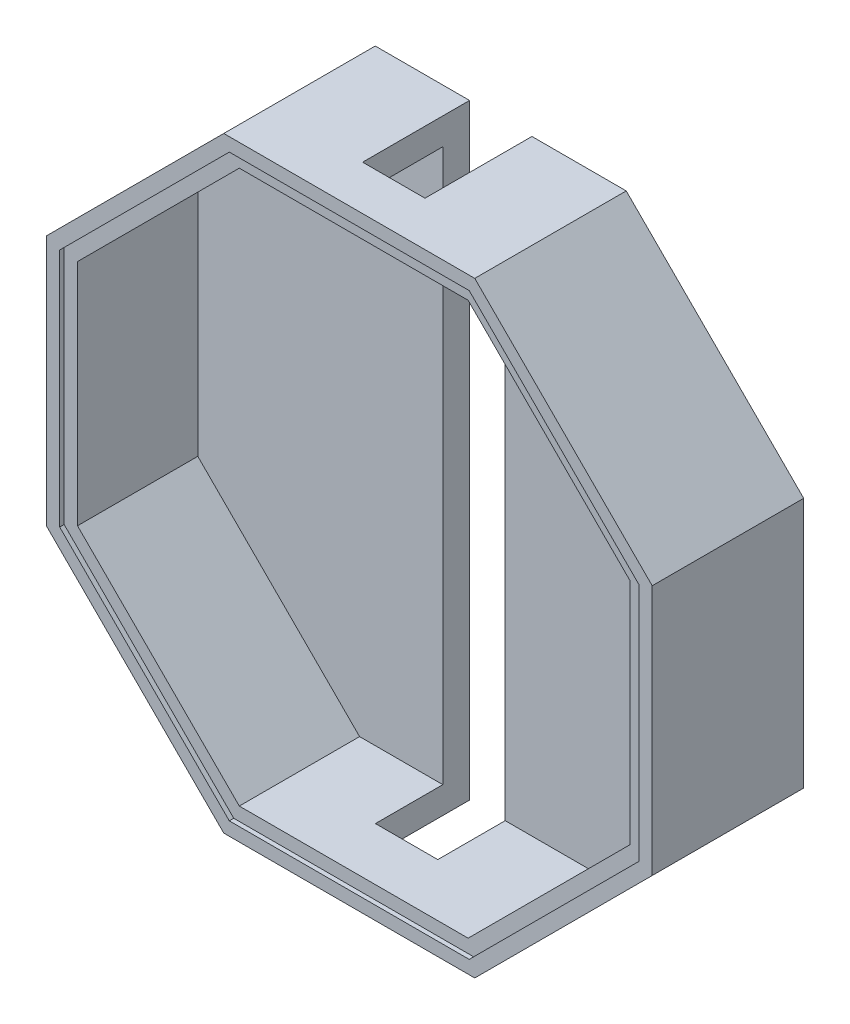
ISO-10303-21;
HEADER;
FILE_DESCRIPTION(('STEP AP214'),'2;1');
FILE_NAME('part.step','',(''),(''),'','','');
FILE_SCHEMA(('AUTOMOTIVE_DESIGN { 1 0 10303 214 1 1 1 1 }'));
ENDSEC;
DATA;
#1=APPLICATION_CONTEXT('core data for automotive mechanical design processes');
#2=APPLICATION_PROTOCOL_DEFINITION('international standard','automotive_design',2000,#1);
#3=PRODUCT_CONTEXT('',#1,'mechanical');
#4=PRODUCT('Part','Part','',(#3));
#5=PRODUCT_RELATED_PRODUCT_CATEGORY('part','',(#4));
#6=PRODUCT_DEFINITION_FORMATION('','',#4);
#7=PRODUCT_DEFINITION_CONTEXT('part definition',#1,'design');
#8=PRODUCT_DEFINITION('design','',#6,#7);
#9=PRODUCT_DEFINITION_SHAPE('','',#8);
#10=(LENGTH_UNIT() NAMED_UNIT(*) SI_UNIT(.MILLI.,.METRE.));
#11=(NAMED_UNIT(*) PLANE_ANGLE_UNIT() SI_UNIT($,.RADIAN.));
#12=(NAMED_UNIT(*) SI_UNIT($,.STERADIAN.) SOLID_ANGLE_UNIT());
#13=UNCERTAINTY_MEASURE_WITH_UNIT(LENGTH_MEASURE(1.E-05),#10,'distance_accuracy_value','');
#14=(GEOMETRIC_REPRESENTATION_CONTEXT(3) GLOBAL_UNCERTAINTY_ASSIGNED_CONTEXT((#13)) GLOBAL_UNIT_ASSIGNED_CONTEXT((#10,
#11,#12)) REPRESENTATION_CONTEXT('',''));
#15=CARTESIAN_POINT('',(0.,0.,0.));
#16=DIRECTION('',(0.,0.,1.));
#17=DIRECTION('',(1.,0.,0.));
#18=AXIS2_PLACEMENT_3D('',#15,#16,#17);
#19=CARTESIAN_POINT('',(-22.225,215.9,12.7));
#20=DIRECTION('',(0.,-0.0220534586670345,0.999756792905565));
#21=DIRECTION('',(0.,-0.999756792905565,-0.0220534586670345));
#22=AXIS2_PLACEMENT_3D('',#19,#20,#21);
#23=PLANE('',#22);
#24=DIRECTION('',(-1.,0.,0.));
#25=VECTOR('',#24,1.);
#26=CARTESIAN_POINT('',(-22.225,-196.85,3.59522058823529));
#27=LINE('',#26,#25);
#28=CARTESIAN_POINT('',(22.225,-196.85,3.59522058823529));
#29=VERTEX_POINT('',#28);
#30=CARTESIAN_POINT('',(-22.225,-196.85,3.59522058823529));
#31=VERTEX_POINT('',#30);
#32=EDGE_CURVE('E279',#29,#31,#27,.T.);
#33=ORIENTED_EDGE('',*,*,#32,.F.);
#34=DIRECTION('',(0.,-0.999756792905565,-0.0220534586670345));
#35=VECTOR('',#34,1.);
#36=CARTESIAN_POINT('',(22.225,215.9,12.7));
#37=LINE('',#36,#35);
#38=CARTESIAN_POINT('',(22.225,-215.9,3.17499999999998));
#39=VERTEX_POINT('',#38);
#40=EDGE_CURVE('E417',#29,#39,#37,.T.);
#41=ORIENTED_EDGE('',*,*,#40,.T.);
#42=DIRECTION('',(1.,0.,0.));
#43=VECTOR('',#42,1.);
#44=CARTESIAN_POINT('',(-22.225,-215.9,3.17499999999999));
#45=LINE('',#44,#43);
#46=CARTESIAN_POINT('',(-22.225,-215.9,3.17499999999999));
#47=VERTEX_POINT('',#46);
#48=EDGE_CURVE('E422',#47,#39,#45,.T.);
#49=ORIENTED_EDGE('',*,*,#48,.F.);
#50=DIRECTION('',(0.,-0.999756792905565,-0.0220534586670345));
#51=VECTOR('',#50,1.);
#52=CARTESIAN_POINT('',(-22.225,215.9,12.7));
#53=LINE('',#52,#51);
#54=EDGE_CURVE('E403',#31,#47,#53,.T.);
#55=ORIENTED_EDGE('',*,*,#54,.F.);
#56=EDGE_LOOP('',(#33,#41,#49,#55));
#57=FACE_BOUND('',#56,.T.);
#58=ADVANCED_FACE('F37',(#57),#23,.F.);
#59=CARTESIAN_POINT('',(-22.225,0.,0.));
#60=DIRECTION('',(-1.,0.,0.));
#61=DIRECTION('',(0.,0.,1.));
#62=AXIS2_PLACEMENT_3D('',#59,#60,#61);
#63=PLANE('',#62);
#64=DIRECTION('',(0.,0.,-1.));
#65=VECTOR('',#64,1.);
#66=CARTESIAN_POINT('',(-22.225,-196.85,0.));
#67=LINE('',#66,#65);
#68=CARTESIAN_POINT('',(-22.225,-196.85,-44.45));
#69=VERTEX_POINT('',#68);
#70=EDGE_CURVE('E270',#31,#69,#67,.T.);
#71=ORIENTED_EDGE('',*,*,#70,.F.);
#72=ORIENTED_EDGE('',*,*,#54,.T.);
#73=DIRECTION('',(0.,0.,-1.));
#74=VECTOR('',#73,1.);
#75=CARTESIAN_POINT('',(-22.225,-215.9,3.17499999999999));
#76=LINE('',#75,#74);
#77=CARTESIAN_POINT('',(-22.225,-215.9,-63.5));
#78=VERTEX_POINT('',#77);
#79=EDGE_CURVE('E407',#47,#78,#76,.T.);
#80=ORIENTED_EDGE('',*,*,#79,.T.);
#81=DIRECTION('',(0.,1.,0.));
#82=VECTOR('',#81,1.);
#83=CARTESIAN_POINT('',(-22.225,-215.9,-63.5));
#84=LINE('',#83,#82);
#85=CARTESIAN_POINT('',(-22.225,215.9,-63.5));
#86=VERTEX_POINT('',#85);
#87=EDGE_CURVE('E415',#78,#86,#84,.T.);
#88=ORIENTED_EDGE('',*,*,#87,.T.);
#89=DIRECTION('',(0.,0.,1.));
#90=VECTOR('',#89,1.);
#91=CARTESIAN_POINT('',(-22.225,215.9,-63.5));
#92=LINE('',#91,#90);
#93=CARTESIAN_POINT('',(-22.225,215.9,12.7));
#94=VERTEX_POINT('',#93);
#95=EDGE_CURVE('E405',#86,#94,#92,.T.);
#96=ORIENTED_EDGE('',*,*,#95,.T.);
#97=CARTESIAN_POINT('',(-22.225,196.85,12.2797794117647));
#98=VERTEX_POINT('',#97);
#99=EDGE_CURVE('E410',#94,#98,#53,.T.);
#100=ORIENTED_EDGE('',*,*,#99,.T.);
#101=DIRECTION('',(0.,0.,-1.));
#102=VECTOR('',#101,1.);
#103=CARTESIAN_POINT('',(-22.225,196.85,0.));
#104=LINE('',#103,#102);
#105=CARTESIAN_POINT('',(-22.225,196.85,-44.45));
#106=VERTEX_POINT('',#105);
#107=EDGE_CURVE('E281',#98,#106,#104,.T.);
#108=ORIENTED_EDGE('',*,*,#107,.T.);
#109=DIRECTION('',(0.,1.,0.));
#110=VECTOR('',#109,1.);
#111=CARTESIAN_POINT('',(-22.225,0.,-44.45));
#112=LINE('',#111,#110);
#113=EDGE_CURVE('E275',#69,#106,#112,.T.);
#114=ORIENTED_EDGE('',*,*,#113,.F.);
#115=EDGE_LOOP('',(#71,#72,#80,#88,#96,#100,#108,#114));
#116=FACE_BOUND('',#115,.T.);
#117=ADVANCED_FACE('F555',(#116),#63,.F.);
#118=CARTESIAN_POINT('',(22.225,0.,0.));
#119=DIRECTION('',(-1.,0.,0.));
#120=DIRECTION('',(0.,0.,1.));
#121=AXIS2_PLACEMENT_3D('',#118,#119,#120);
#122=PLANE('',#121);
#123=ORIENTED_EDGE('',*,*,#40,.F.);
#124=DIRECTION('',(0.,0.,-1.));
#125=VECTOR('',#124,1.);
#126=CARTESIAN_POINT('',(22.225,-196.85,0.));
#127=LINE('',#126,#125);
#128=CARTESIAN_POINT('',(22.225,-196.85,-44.45));
#129=VERTEX_POINT('',#128);
#130=EDGE_CURVE('E271',#29,#129,#127,.T.);
#131=ORIENTED_EDGE('',*,*,#130,.T.);
#132=DIRECTION('',(0.,1.,0.));
#133=VECTOR('',#132,1.);
#134=CARTESIAN_POINT('',(22.225,0.,-44.45));
#135=LINE('',#134,#133);
#136=CARTESIAN_POINT('',(22.225,196.85,-44.45));
#137=VERTEX_POINT('',#136);
#138=EDGE_CURVE('E252',#129,#137,#135,.T.);
#139=ORIENTED_EDGE('',*,*,#138,.T.);
#140=DIRECTION('',(0.,0.,-1.));
#141=VECTOR('',#140,1.);
#142=CARTESIAN_POINT('',(22.225,196.85,0.));
#143=LINE('',#142,#141);
#144=CARTESIAN_POINT('',(22.225,196.85,12.2797794117647));
#145=VERTEX_POINT('',#144);
#146=EDGE_CURVE('E265',#145,#137,#143,.T.);
#147=ORIENTED_EDGE('',*,*,#146,.F.);
#148=CARTESIAN_POINT('',(22.225,215.9,12.7));
#149=VERTEX_POINT('',#148);
#150=EDGE_CURVE('E416',#149,#145,#37,.T.);
#151=ORIENTED_EDGE('',*,*,#150,.F.);
#152=DIRECTION('',(0.,0.,1.));
#153=VECTOR('',#152,1.);
#154=CARTESIAN_POINT('',(22.225,215.9,-63.5));
#155=LINE('',#154,#153);
#156=CARTESIAN_POINT('',(22.225,215.9,-63.5));
#157=VERTEX_POINT('',#156);
#158=EDGE_CURVE('E259',#157,#149,#155,.T.);
#159=ORIENTED_EDGE('',*,*,#158,.F.);
#160=DIRECTION('',(0.,1.,0.));
#161=VECTOR('',#160,1.);
#162=CARTESIAN_POINT('',(22.225,-215.9,-63.5));
#163=LINE('',#162,#161);
#164=CARTESIAN_POINT('',(22.225,-215.9,-63.5));
#165=VERTEX_POINT('',#164);
#166=EDGE_CURVE('E408',#165,#157,#163,.T.);
#167=ORIENTED_EDGE('',*,*,#166,.F.);
#168=DIRECTION('',(0.,0.,-1.));
#169=VECTOR('',#168,1.);
#170=CARTESIAN_POINT('',(22.225,-215.9,3.17499999999999));
#171=LINE('',#170,#169);
#172=EDGE_CURVE('E419',#39,#165,#171,.T.);
#173=ORIENTED_EDGE('',*,*,#172,.F.);
#174=EDGE_LOOP('',(#123,#131,#139,#147,#151,#159,#167,#173));
#175=FACE_BOUND('',#174,.T.);
#176=ADVANCED_FACE('F269',(#175),#122,.T.);
#177=CARTESIAN_POINT('',(0.,0.,44.45));
#178=DIRECTION('',(0.,0.,-1.));
#179=DIRECTION('',(-1.,0.,0.));
#180=AXIS2_PLACEMENT_3D('',#177,#178,#179);
#181=PLANE('',#180);
#182=DIRECTION('',(-1.,0.,0.));
#183=VECTOR('',#182,1.);
#184=CARTESIAN_POINT('',(85.4833239347475,206.375,44.45));
#185=LINE('',#184,#183);
#186=CARTESIAN_POINT('',(85.4833239347475,206.375,44.45));
#187=VERTEX_POINT('',#186);
#188=CARTESIAN_POINT('',(-85.4833239347476,206.375,44.45));
#189=VERTEX_POINT('',#188);
#190=EDGE_CURVE('E311',#187,#189,#185,.T.);
#191=ORIENTED_EDGE('',*,*,#190,.F.);
#192=DIRECTION('',(-0.707106781186548,0.707106781186547,0.));
#193=VECTOR('',#192,1.);
#194=CARTESIAN_POINT('',(206.375,85.4833239347476,44.45));
#195=LINE('',#194,#193);
#196=CARTESIAN_POINT('',(206.375,85.4833239347476,44.45));
#197=VERTEX_POINT('',#196);
#198=EDGE_CURVE('E61',#197,#187,#195,.T.);
#199=ORIENTED_EDGE('',*,*,#198,.F.);
#200=DIRECTION('',(0.,1.,0.));
#201=VECTOR('',#200,1.);
#202=CARTESIAN_POINT('',(206.375,-85.4833239347475,44.45));
#203=LINE('',#202,#201);
#204=CARTESIAN_POINT('',(206.375,-85.4833239347475,44.45));
#205=VERTEX_POINT('',#204);
#206=EDGE_CURVE('E289',#205,#197,#203,.T.);
#207=ORIENTED_EDGE('',*,*,#206,.F.);
#208=DIRECTION('',(0.707106781186547,0.707106781186548,0.));
#209=VECTOR('',#208,1.);
#210=CARTESIAN_POINT('',(85.4833239347476,-206.375,44.45));
#211=LINE('',#210,#209);
#212=CARTESIAN_POINT('',(85.4833239347476,-206.375,44.45));
#213=VERTEX_POINT('',#212);
#214=EDGE_CURVE('E327',#213,#205,#211,.T.);
#215=ORIENTED_EDGE('',*,*,#214,.F.);
#216=DIRECTION('',(1.,0.,0.));
#217=VECTOR('',#216,1.);
#218=CARTESIAN_POINT('',(-85.4833239347473,-206.375,44.45));
#219=LINE('',#218,#217);
#220=CARTESIAN_POINT('',(-85.4833239347473,-206.375,44.45));
#221=VERTEX_POINT('',#220);
#222=EDGE_CURVE('E324',#221,#213,#219,.T.);
#223=ORIENTED_EDGE('',*,*,#222,.F.);
#224=DIRECTION('',(0.707106781186548,-0.707106781186547,0.));
#225=VECTOR('',#224,1.);
#226=CARTESIAN_POINT('',(-206.375,-85.4833239347475,44.45));
#227=LINE('',#226,#225);
#228=CARTESIAN_POINT('',(-206.375,-85.4833239347475,44.45));
#229=VERTEX_POINT('',#228);
#230=EDGE_CURVE('E325',#229,#221,#227,.T.);
#231=ORIENTED_EDGE('',*,*,#230,.F.);
#232=DIRECTION('',(0.,-1.,0.));
#233=VECTOR('',#232,1.);
#234=CARTESIAN_POINT('',(-206.375,85.4833239347474,44.45));
#235=LINE('',#234,#233);
#236=CARTESIAN_POINT('',(-206.375,85.4833239347474,44.45));
#237=VERTEX_POINT('',#236);
#238=EDGE_CURVE('E317',#237,#229,#235,.T.);
#239=ORIENTED_EDGE('',*,*,#238,.F.);
#240=DIRECTION('',(-0.707106781186547,-0.707106781186548,0.));
#241=VECTOR('',#240,1.);
#242=CARTESIAN_POINT('',(-85.4833239347476,206.375,44.45));
#243=LINE('',#242,#241);
#244=EDGE_CURVE('E316',#189,#237,#243,.T.);
#245=ORIENTED_EDGE('',*,*,#244,.F.);
#246=EDGE_LOOP('',(#191,#199,#207,#215,#223,#231,#239,#245));
#247=FACE_BOUND('',#246,.T.);
#248=DIRECTION('',(-1.,0.,0.));
#249=VECTOR('',#248,1.);
#250=CARTESIAN_POINT('',(0.,215.9,44.45));
#251=LINE('',#250,#249);
#252=CARTESIAN_POINT('',(89.4287081163512,215.9,44.45));
#253=VERTEX_POINT('',#252);
#254=CARTESIAN_POINT('',(-89.4287081163513,215.9,44.45));
#255=VERTEX_POINT('',#254);
#256=EDGE_CURVE('E464',#253,#255,#251,.T.);
#257=ORIENTED_EDGE('',*,*,#256,.T.);
#258=DIRECTION('',(-0.707106781186547,-0.707106781186548,0.));
#259=VECTOR('',#258,1.);
#260=CARTESIAN_POINT('',(-89.4287081163513,215.9,44.45));
#261=LINE('',#260,#259);
#262=CARTESIAN_POINT('',(-215.9,89.4287081163511,44.45));
#263=VERTEX_POINT('',#262);
#264=EDGE_CURVE('E428',#255,#263,#261,.T.);
#265=ORIENTED_EDGE('',*,*,#264,.T.);
#266=DIRECTION('',(0.,1.,0.));
#267=VECTOR('',#266,1.);
#268=CARTESIAN_POINT('',(-215.9,0.,44.45));
#269=LINE('',#268,#267);
#270=CARTESIAN_POINT('',(-215.9,-89.4287081163512,44.45));
#271=VERTEX_POINT('',#270);
#272=EDGE_CURVE('E459',#263,#271,#269,.F.);
#273=ORIENTED_EDGE('',*,*,#272,.T.);
#274=DIRECTION('',(0.707106781186548,-0.707106781186547,0.));
#275=VECTOR('',#274,1.);
#276=CARTESIAN_POINT('',(-215.9,-89.4287081163512,44.45));
#277=LINE('',#276,#275);
#278=CARTESIAN_POINT('',(-89.428708116351,-215.9,44.45));
#279=VERTEX_POINT('',#278);
#280=EDGE_CURVE('E475',#271,#279,#277,.T.);
#281=ORIENTED_EDGE('',*,*,#280,.T.);
#282=DIRECTION('',(-1.,0.,0.));
#283=VECTOR('',#282,1.);
#284=CARTESIAN_POINT('',(0.,-215.9,44.45));
#285=LINE('',#284,#283);
#286=CARTESIAN_POINT('',(89.4287081163513,-215.9,44.45));
#287=VERTEX_POINT('',#286);
#288=EDGE_CURVE('E487',#279,#287,#285,.F.);
#289=ORIENTED_EDGE('',*,*,#288,.T.);
#290=DIRECTION('',(0.707106781186547,0.707106781186548,0.));
#291=VECTOR('',#290,1.);
#292=CARTESIAN_POINT('',(89.4287081163513,-215.9,44.45));
#293=LINE('',#292,#291);
#294=CARTESIAN_POINT('',(215.9,-89.4287081163512,44.45));
#295=VERTEX_POINT('',#294);
#296=EDGE_CURVE('E480',#287,#295,#293,.T.);
#297=ORIENTED_EDGE('',*,*,#296,.T.);
#298=DIRECTION('',(0.,1.,0.));
#299=VECTOR('',#298,1.);
#300=CARTESIAN_POINT('',(215.9,0.,44.45));
#301=LINE('',#300,#299);
#302=CARTESIAN_POINT('',(215.9,89.4287081163513,44.45));
#303=VERTEX_POINT('',#302);
#304=EDGE_CURVE('E486',#295,#303,#301,.T.);
#305=ORIENTED_EDGE('',*,*,#304,.T.);
#306=DIRECTION('',(-0.707106781186548,0.707106781186547,0.));
#307=VECTOR('',#306,1.);
#308=CARTESIAN_POINT('',(215.9,89.4287081163513,44.45));
#309=LINE('',#308,#307);
#310=EDGE_CURVE('E433',#303,#253,#309,.T.);
#311=ORIENTED_EDGE('',*,*,#310,.T.);
#312=EDGE_LOOP('',(#257,#265,#273,#281,#289,#297,#305,#311));
#313=FACE_BOUND('',#312,.T.);
#314=ADVANCED_FACE('F493',(#247,#313),#181,.F.);
#315=CARTESIAN_POINT('',(0.,0.,-63.5));
#316=DIRECTION('',(0.,0.,-1.));
#317=DIRECTION('',(-1.,0.,0.));
#318=AXIS2_PLACEMENT_3D('',#315,#316,#317);
#319=PLANE('',#318);
#320=DIRECTION('',(1.,0.,0.));
#321=VECTOR('',#320,1.);
#322=CARTESIAN_POINT('',(215.9,-215.9,-63.5));
#323=LINE('',#322,#321);
#324=CARTESIAN_POINT('',(89.4287081163513,-215.9,-63.5));
#325=VERTEX_POINT('',#324);
#326=EDGE_CURVE('E461',#165,#325,#323,.T.);
#327=ORIENTED_EDGE('',*,*,#326,.F.);
#328=ORIENTED_EDGE('',*,*,#166,.T.);
#329=DIRECTION('',(-1.,0.,0.));
#330=VECTOR('',#329,1.);
#331=CARTESIAN_POINT('',(215.9,215.9,-63.5));
#332=LINE('',#331,#330);
#333=CARTESIAN_POINT('',(89.4287081163512,215.9,-63.5));
#334=VERTEX_POINT('',#333);
#335=EDGE_CURVE('E48',#334,#157,#332,.T.);
#336=ORIENTED_EDGE('',*,*,#335,.F.);
#337=DIRECTION('',(-0.707106781186548,0.707106781186547,0.));
#338=VECTOR('',#337,1.);
#339=CARTESIAN_POINT('',(215.9,89.4287081163513,-63.5));
#340=LINE('',#339,#338);
#341=CARTESIAN_POINT('',(215.9,89.4287081163513,-63.5));
#342=VERTEX_POINT('',#341);
#343=EDGE_CURVE('E440',#342,#334,#340,.T.);
#344=ORIENTED_EDGE('',*,*,#343,.F.);
#345=DIRECTION('',(0.,1.,0.));
#346=VECTOR('',#345,1.);
#347=CARTESIAN_POINT('',(215.9,215.9,-63.5));
#348=LINE('',#347,#346);
#349=CARTESIAN_POINT('',(215.9,-89.4287081163512,-63.5));
#350=VERTEX_POINT('',#349);
#351=EDGE_CURVE('E466',#350,#342,#348,.T.);
#352=ORIENTED_EDGE('',*,*,#351,.F.);
#353=DIRECTION('',(0.707106781186547,0.707106781186548,0.));
#354=VECTOR('',#353,1.);
#355=CARTESIAN_POINT('',(89.4287081163513,-215.9,-63.5));
#356=LINE('',#355,#354);
#357=EDGE_CURVE('E434',#325,#350,#356,.T.);
#358=ORIENTED_EDGE('',*,*,#357,.F.);
#359=EDGE_LOOP('',(#327,#328,#336,#344,#352,#358));
#360=FACE_BOUND('',#359,.T.);
#361=ADVANCED_FACE('F528',(#360),#319,.T.);
#362=CARTESIAN_POINT('',(215.9,215.9,-63.5));
#363=DIRECTION('',(0.,1.,0.));
#364=DIRECTION('',(-1.,0.,0.));
#365=AXIS2_PLACEMENT_3D('',#362,#363,#364);
#366=PLANE('',#365);
#367=ORIENTED_EDGE('',*,*,#335,.T.);
#368=ORIENTED_EDGE('',*,*,#158,.T.);
#369=DIRECTION('',(1.,0.,0.));
#370=VECTOR('',#369,1.);
#371=CARTESIAN_POINT('',(-22.225,215.9,12.7));
#372=LINE('',#371,#370);
#373=EDGE_CURVE('E412',#94,#149,#372,.T.);
#374=ORIENTED_EDGE('',*,*,#373,.F.);
#375=ORIENTED_EDGE('',*,*,#95,.F.);
#376=CARTESIAN_POINT('',(-89.4287081163513,215.9,-63.5));
#377=VERTEX_POINT('',#376);
#378=EDGE_CURVE('E473',#86,#377,#332,.T.);
#379=ORIENTED_EDGE('',*,*,#378,.T.);
#380=DIRECTION('',(0.,0.,1.));
#381=VECTOR('',#380,1.);
#382=CARTESIAN_POINT('',(-89.4287081163513,215.9,-63.5));
#383=LINE('',#382,#381);
#384=EDGE_CURVE('E457',#377,#255,#383,.T.);
#385=ORIENTED_EDGE('',*,*,#384,.T.);
#386=ORIENTED_EDGE('',*,*,#256,.F.);
#387=DIRECTION('',(0.,0.,1.));
#388=VECTOR('',#387,1.);
#389=CARTESIAN_POINT('',(89.4287081163512,215.9,-63.5));
#390=LINE('',#389,#388);
#391=EDGE_CURVE('E452',#334,#253,#390,.T.);
#392=ORIENTED_EDGE('',*,*,#391,.F.);
#393=EDGE_LOOP('',(#367,#368,#374,#375,#379,#385,#386,#392));
#394=FACE_BOUND('',#393,.T.);
#395=ADVANCED_FACE('F530',(#394),#366,.T.);
#396=CARTESIAN_POINT('',(215.9,-215.9,-63.5));
#397=DIRECTION('',(0.,-1.,0.));
#398=DIRECTION('',(1.,0.,0.));
#399=AXIS2_PLACEMENT_3D('',#396,#397,#398);
#400=PLANE('',#399);
#401=ORIENTED_EDGE('',*,*,#48,.T.);
#402=ORIENTED_EDGE('',*,*,#172,.T.);
#403=ORIENTED_EDGE('',*,*,#326,.T.);
#404=DIRECTION('',(0.,0.,1.));
#405=VECTOR('',#404,1.);
#406=CARTESIAN_POINT('',(89.4287081163513,-215.9,-63.5));
#407=LINE('',#406,#405);
#408=EDGE_CURVE('E448',#325,#287,#407,.T.);
#409=ORIENTED_EDGE('',*,*,#408,.T.);
#410=ORIENTED_EDGE('',*,*,#288,.F.);
#411=DIRECTION('',(0.,0.,1.));
#412=VECTOR('',#411,1.);
#413=CARTESIAN_POINT('',(-89.428708116351,-215.9,-63.5));
#414=LINE('',#413,#412);
#415=CARTESIAN_POINT('',(-89.428708116351,-215.9,-63.5));
#416=VERTEX_POINT('',#415);
#417=EDGE_CURVE('E441',#416,#279,#414,.T.);
#418=ORIENTED_EDGE('',*,*,#417,.F.);
#419=EDGE_CURVE('E462',#416,#78,#323,.T.);
#420=ORIENTED_EDGE('',*,*,#419,.T.);
#421=ORIENTED_EDGE('',*,*,#79,.F.);
#422=EDGE_LOOP('',(#401,#402,#403,#409,#410,#418,#420,#421));
#423=FACE_BOUND('',#422,.T.);
#424=ADVANCED_FACE('F512',(#423),#400,.T.);
#425=CARTESIAN_POINT('',(-215.9,215.9,-63.5));
#426=DIRECTION('',(-1.,0.,0.));
#427=DIRECTION('',(0.,-1.,0.));
#428=AXIS2_PLACEMENT_3D('',#425,#426,#427);
#429=PLANE('',#428);
#430=DIRECTION('',(0.,0.,1.));
#431=VECTOR('',#430,1.);
#432=CARTESIAN_POINT('',(-215.9,89.4287081163511,-63.5));
#433=LINE('',#432,#431);
#434=CARTESIAN_POINT('',(-215.9,89.4287081163511,-63.5));
#435=VERTEX_POINT('',#434);
#436=EDGE_CURVE('E438',#435,#263,#433,.T.);
#437=ORIENTED_EDGE('',*,*,#436,.F.);
#438=DIRECTION('',(0.,-1.,0.));
#439=VECTOR('',#438,1.);
#440=CARTESIAN_POINT('',(-215.9,215.9,-63.5));
#441=LINE('',#440,#439);
#442=CARTESIAN_POINT('',(-215.9,-89.4287081163512,-63.5));
#443=VERTEX_POINT('',#442);
#444=EDGE_CURVE('E458',#435,#443,#441,.T.);
#445=ORIENTED_EDGE('',*,*,#444,.T.);
#446=DIRECTION('',(0.,0.,1.));
#447=VECTOR('',#446,1.);
#448=CARTESIAN_POINT('',(-215.9,-89.4287081163512,-63.5));
#449=LINE('',#448,#447);
#450=EDGE_CURVE('E442',#443,#271,#449,.T.);
#451=ORIENTED_EDGE('',*,*,#450,.T.);
#452=ORIENTED_EDGE('',*,*,#272,.F.);
#453=EDGE_LOOP('',(#437,#445,#451,#452));
#454=FACE_BOUND('',#453,.T.);
#455=ADVANCED_FACE('F45',(#454),#429,.T.);
#456=CARTESIAN_POINT('',(215.9,215.9,-63.5));
#457=DIRECTION('',(1.,0.,0.));
#458=DIRECTION('',(0.,1.,0.));
#459=AXIS2_PLACEMENT_3D('',#456,#457,#458);
#460=PLANE('',#459);
#461=DIRECTION('',(0.,0.,1.));
#462=VECTOR('',#461,1.);
#463=CARTESIAN_POINT('',(215.9,-89.4287081163512,-63.5));
#464=LINE('',#463,#462);
#465=EDGE_CURVE('E449',#350,#295,#464,.T.);
#466=ORIENTED_EDGE('',*,*,#465,.F.);
#467=ORIENTED_EDGE('',*,*,#351,.T.);
#468=DIRECTION('',(0.,0.,1.));
#469=VECTOR('',#468,1.);
#470=CARTESIAN_POINT('',(215.9,89.4287081163513,-63.5));
#471=LINE('',#470,#469);
#472=EDGE_CURVE('E453',#342,#303,#471,.T.);
#473=ORIENTED_EDGE('',*,*,#472,.T.);
#474=ORIENTED_EDGE('',*,*,#304,.F.);
#475=EDGE_LOOP('',(#466,#467,#473,#474));
#476=FACE_BOUND('',#475,.T.);
#477=ADVANCED_FACE('F520',(#476),#460,.T.);
#478=ORIENTED_EDGE('',*,*,#87,.F.);
#479=ORIENTED_EDGE('',*,*,#419,.F.);
#480=DIRECTION('',(0.707106781186548,-0.707106781186547,0.));
#481=VECTOR('',#480,1.);
#482=CARTESIAN_POINT('',(-215.9,-89.4287081163512,-63.5));
#483=LINE('',#482,#481);
#484=EDGE_CURVE('E435',#443,#416,#483,.T.);
#485=ORIENTED_EDGE('',*,*,#484,.F.);
#486=ORIENTED_EDGE('',*,*,#444,.F.);
#487=DIRECTION('',(-0.707106781186547,-0.707106781186548,0.));
#488=VECTOR('',#487,1.);
#489=CARTESIAN_POINT('',(-89.4287081163513,215.9,-63.5));
#490=LINE('',#489,#488);
#491=EDGE_CURVE('E429',#377,#435,#490,.T.);
#492=ORIENTED_EDGE('',*,*,#491,.F.);
#493=ORIENTED_EDGE('',*,*,#378,.F.);
#494=EDGE_LOOP('',(#478,#479,#485,#486,#492,#493));
#495=FACE_BOUND('',#494,.T.);
#496=ADVANCED_FACE('F508',(#495),#319,.T.);
#497=CARTESIAN_POINT('',(-215.9,-89.4287081163512,-63.5));
#498=DIRECTION('',(-0.707106781186547,-0.707106781186548,0.));
#499=DIRECTION('',(0.707106781186548,-0.707106781186547,0.));
#500=AXIS2_PLACEMENT_3D('',#497,#498,#499);
#501=PLANE('',#500);
#502=ORIENTED_EDGE('',*,*,#450,.F.);
#503=ORIENTED_EDGE('',*,*,#484,.T.);
#504=ORIENTED_EDGE('',*,*,#417,.T.);
#505=ORIENTED_EDGE('',*,*,#280,.F.);
#506=EDGE_LOOP('',(#502,#503,#504,#505));
#507=FACE_BOUND('',#506,.T.);
#508=ADVANCED_FACE('F503',(#507),#501,.T.);
#509=CARTESIAN_POINT('',(89.4287081163513,-215.9,-63.5));
#510=DIRECTION('',(0.707106781186548,-0.707106781186547,0.));
#511=DIRECTION('',(0.707106781186547,0.707106781186548,0.));
#512=AXIS2_PLACEMENT_3D('',#509,#510,#511);
#513=PLANE('',#512);
#514=ORIENTED_EDGE('',*,*,#408,.F.);
#515=ORIENTED_EDGE('',*,*,#357,.T.);
#516=ORIENTED_EDGE('',*,*,#465,.T.);
#517=ORIENTED_EDGE('',*,*,#296,.F.);
#518=EDGE_LOOP('',(#514,#515,#516,#517));
#519=FACE_BOUND('',#518,.T.);
#520=ADVANCED_FACE('F550',(#519),#513,.T.);
#521=CARTESIAN_POINT('',(215.9,89.4287081163513,-63.5));
#522=DIRECTION('',(0.707106781186547,0.707106781186548,0.));
#523=DIRECTION('',(-0.707106781186548,0.707106781186547,0.));
#524=AXIS2_PLACEMENT_3D('',#521,#522,#523);
#525=PLANE('',#524);
#526=ORIENTED_EDGE('',*,*,#472,.F.);
#527=ORIENTED_EDGE('',*,*,#343,.T.);
#528=ORIENTED_EDGE('',*,*,#391,.T.);
#529=ORIENTED_EDGE('',*,*,#310,.F.);
#530=EDGE_LOOP('',(#526,#527,#528,#529));
#531=FACE_BOUND('',#530,.T.);
#532=ADVANCED_FACE('F523',(#531),#525,.T.);
#533=CARTESIAN_POINT('',(-89.4287081163513,215.9,-63.5));
#534=DIRECTION('',(-0.707106781186548,0.707106781186547,0.));
#535=DIRECTION('',(-0.707106781186547,-0.707106781186548,0.));
#536=AXIS2_PLACEMENT_3D('',#533,#534,#535);
#537=PLANE('',#536);
#538=ORIENTED_EDGE('',*,*,#384,.F.);
#539=ORIENTED_EDGE('',*,*,#491,.T.);
#540=ORIENTED_EDGE('',*,*,#436,.T.);
#541=ORIENTED_EDGE('',*,*,#264,.F.);
#542=EDGE_LOOP('',(#538,#539,#540,#541));
#543=FACE_BOUND('',#542,.T.);
#544=ADVANCED_FACE('F532',(#543),#537,.T.);
#545=ORIENTED_EDGE('',*,*,#150,.T.);
#546=DIRECTION('',(-1.,0.,0.));
#547=VECTOR('',#546,1.);
#548=CARTESIAN_POINT('',(-22.225,196.85,12.2797794117647));
#549=LINE('',#548,#547);
#550=EDGE_CURVE('E54',#145,#98,#549,.T.);
#551=ORIENTED_EDGE('',*,*,#550,.T.);
#552=ORIENTED_EDGE('',*,*,#99,.F.);
#553=ORIENTED_EDGE('',*,*,#373,.T.);
#554=EDGE_LOOP('',(#545,#551,#552,#553));
#555=FACE_BOUND('',#554,.T.);
#556=ADVANCED_FACE('F540',(#555),#23,.F.);
#557=CARTESIAN_POINT('',(0.,0.,41.275));
#558=DIRECTION('',(0.,0.,1.));
#559=DIRECTION('',(1.,0.,0.));
#560=AXIS2_PLACEMENT_3D('',#557,#558,#559);
#561=PLANE('',#560);
#562=DIRECTION('',(-0.707106781186548,0.707106781186547,0.));
#563=VECTOR('',#562,1.);
#564=CARTESIAN_POINT('',(206.375,85.4833239347476,41.275));
#565=LINE('',#564,#563);
#566=CARTESIAN_POINT('',(206.375,85.4833239347476,41.275));
#567=VERTEX_POINT('',#566);
#568=CARTESIAN_POINT('',(85.4833239347475,206.375,41.275));
#569=VERTEX_POINT('',#568);
#570=EDGE_CURVE('E288',#567,#569,#565,.T.);
#571=ORIENTED_EDGE('',*,*,#570,.T.);
#572=DIRECTION('',(-1.,0.,0.));
#573=VECTOR('',#572,1.);
#574=CARTESIAN_POINT('',(85.4833239347475,206.375,41.275));
#575=LINE('',#574,#573);
#576=CARTESIAN_POINT('',(-85.4833239347476,206.375,41.275));
#577=VERTEX_POINT('',#576);
#578=EDGE_CURVE('E287',#569,#577,#575,.T.);
#579=ORIENTED_EDGE('',*,*,#578,.T.);
#580=DIRECTION('',(-0.707106781186547,-0.707106781186548,0.));
#581=VECTOR('',#580,1.);
#582=CARTESIAN_POINT('',(-85.4833239347476,206.375,41.275));
#583=LINE('',#582,#581);
#584=CARTESIAN_POINT('',(-206.375,85.4833239347474,41.275));
#585=VERTEX_POINT('',#584);
#586=EDGE_CURVE('E291',#577,#585,#583,.T.);
#587=ORIENTED_EDGE('',*,*,#586,.T.);
#588=DIRECTION('',(0.,-1.,0.));
#589=VECTOR('',#588,1.);
#590=CARTESIAN_POINT('',(-206.375,85.4833239347474,41.275));
#591=LINE('',#590,#589);
#592=CARTESIAN_POINT('',(-206.375,-85.4833239347475,41.275));
#593=VERTEX_POINT('',#592);
#594=EDGE_CURVE('E298',#585,#593,#591,.T.);
#595=ORIENTED_EDGE('',*,*,#594,.T.);
#596=DIRECTION('',(0.707106781186548,-0.707106781186547,0.));
#597=VECTOR('',#596,1.);
#598=CARTESIAN_POINT('',(-206.375,-85.4833239347475,41.275));
#599=LINE('',#598,#597);
#600=CARTESIAN_POINT('',(-85.4833239347473,-206.375,41.275));
#601=VERTEX_POINT('',#600);
#602=EDGE_CURVE('E299',#593,#601,#599,.T.);
#603=ORIENTED_EDGE('',*,*,#602,.T.);
#604=DIRECTION('',(1.,0.,0.));
#605=VECTOR('',#604,1.);
#606=CARTESIAN_POINT('',(-85.4833239347473,-206.375,41.275));
#607=LINE('',#606,#605);
#608=CARTESIAN_POINT('',(85.4833239347476,-206.375,41.275));
#609=VERTEX_POINT('',#608);
#610=EDGE_CURVE('E305',#601,#609,#607,.T.);
#611=ORIENTED_EDGE('',*,*,#610,.T.);
#612=DIRECTION('',(0.707106781186547,0.707106781186548,0.));
#613=VECTOR('',#612,1.);
#614=CARTESIAN_POINT('',(85.4833239347476,-206.375,41.275));
#615=LINE('',#614,#613);
#616=CARTESIAN_POINT('',(206.375,-85.4833239347475,41.275));
#617=VERTEX_POINT('',#616);
#618=EDGE_CURVE('E304',#609,#617,#615,.T.);
#619=ORIENTED_EDGE('',*,*,#618,.T.);
#620=DIRECTION('',(0.,1.,0.));
#621=VECTOR('',#620,1.);
#622=CARTESIAN_POINT('',(206.375,-85.4833239347475,41.275));
#623=LINE('',#622,#621);
#624=EDGE_CURVE('E306',#617,#567,#623,.T.);
#625=ORIENTED_EDGE('',*,*,#624,.T.);
#626=EDGE_LOOP('',(#571,#579,#587,#595,#603,#611,#619,#625));
#627=FACE_BOUND('',#626,.T.);
#628=DIRECTION('',(-0.707106781186547,-0.707106781186548,0.));
#629=VECTOR('',#628,1.);
#630=CARTESIAN_POINT('',(75.9583239347476,-202.429615818396,41.275));
#631=LINE('',#630,#629);
#632=CARTESIAN_POINT('',(196.85,-81.5379397531439,41.275));
#633=VERTEX_POINT('',#632);
#634=CARTESIAN_POINT('',(81.537939753144,-196.85,41.275));
#635=VERTEX_POINT('',#634);
#636=EDGE_CURVE('E359',#633,#635,#631,.T.);
#637=ORIENTED_EDGE('',*,*,#636,.T.);
#638=DIRECTION('',(-1.,0.,0.));
#639=VECTOR('',#638,1.);
#640=CARTESIAN_POINT('',(215.9,-196.85,41.275));
#641=LINE('',#640,#639);
#642=CARTESIAN_POINT('',(-81.5379397531436,-196.85,41.275));
#643=VERTEX_POINT('',#642);
#644=EDGE_CURVE('E356',#635,#643,#641,.T.);
#645=ORIENTED_EDGE('',*,*,#644,.T.);
#646=DIRECTION('',(-0.707106781186548,0.707106781186547,0.));
#647=VECTOR('',#646,1.);
#648=CARTESIAN_POINT('',(-202.429615818396,-75.9583239347475,41.275));
#649=LINE('',#648,#647);
#650=CARTESIAN_POINT('',(-196.85,-81.5379397531438,41.275));
#651=VERTEX_POINT('',#650);
#652=EDGE_CURVE('E354',#643,#651,#649,.T.);
#653=ORIENTED_EDGE('',*,*,#652,.T.);
#654=DIRECTION('',(0.,1.,0.));
#655=VECTOR('',#654,1.);
#656=CARTESIAN_POINT('',(-196.85,215.9,41.275));
#657=LINE('',#656,#655);
#658=CARTESIAN_POINT('',(-196.85,81.5379397531437,41.275));
#659=VERTEX_POINT('',#658);
#660=EDGE_CURVE('E333',#651,#659,#657,.T.);
#661=ORIENTED_EDGE('',*,*,#660,.T.);
#662=DIRECTION('',(0.707106781186547,0.707106781186548,0.));
#663=VECTOR('',#662,1.);
#664=CARTESIAN_POINT('',(-75.9583239347475,202.429615818396,41.275));
#665=LINE('',#664,#663);
#666=CARTESIAN_POINT('',(-81.5379397531439,196.85,41.275));
#667=VERTEX_POINT('',#666);
#668=EDGE_CURVE('E12',#659,#667,#665,.T.);
#669=ORIENTED_EDGE('',*,*,#668,.T.);
#670=DIRECTION('',(1.,0.,0.));
#671=VECTOR('',#670,1.);
#672=CARTESIAN_POINT('',(215.9,196.85,41.275));
#673=LINE('',#672,#671);
#674=CARTESIAN_POINT('',(81.5379397531439,196.85,41.275));
#675=VERTEX_POINT('',#674);
#676=EDGE_CURVE('E348',#667,#675,#673,.T.);
#677=ORIENTED_EDGE('',*,*,#676,.T.);
#678=DIRECTION('',(0.707106781186548,-0.707106781186547,0.));
#679=VECTOR('',#678,1.);
#680=CARTESIAN_POINT('',(202.429615818396,75.9583239347475,41.275));
#681=LINE('',#680,#679);
#682=CARTESIAN_POINT('',(196.85,81.537939753144,41.275));
#683=VERTEX_POINT('',#682);
#684=EDGE_CURVE('E355',#675,#683,#681,.T.);
#685=ORIENTED_EDGE('',*,*,#684,.T.);
#686=DIRECTION('',(0.,-1.,0.));
#687=VECTOR('',#686,1.);
#688=CARTESIAN_POINT('',(196.85,215.9,41.275));
#689=LINE('',#688,#687);
#690=EDGE_CURVE('E358',#683,#633,#689,.T.);
#691=ORIENTED_EDGE('',*,*,#690,.T.);
#692=EDGE_LOOP('',(#637,#645,#653,#661,#669,#677,#685,#691));
#693=FACE_BOUND('',#692,.T.);
#694=ADVANCED_FACE('F542',(#627,#693),#561,.T.);
#695=CARTESIAN_POINT('',(206.375,85.4833239347476,41.275));
#696=DIRECTION('',(0.707106781186547,0.707106781186548,0.));
#697=DIRECTION('',(-0.707106781186548,0.707106781186547,0.));
#698=AXIS2_PLACEMENT_3D('',#695,#696,#697);
#699=PLANE('',#698);
#700=ORIENTED_EDGE('',*,*,#198,.T.);
#701=DIRECTION('',(0.,0.,1.));
#702=VECTOR('',#701,1.);
#703=CARTESIAN_POINT('',(85.4833239347475,206.375,41.275));
#704=LINE('',#703,#702);
#705=EDGE_CURVE('E313',#569,#187,#704,.T.);
#706=ORIENTED_EDGE('',*,*,#705,.F.);
#707=ORIENTED_EDGE('',*,*,#570,.F.);
#708=DIRECTION('',(0.,0.,1.));
#709=VECTOR('',#708,1.);
#710=CARTESIAN_POINT('',(206.375,85.4833239347476,41.275));
#711=LINE('',#710,#709);
#712=EDGE_CURVE('E334',#567,#197,#711,.T.);
#713=ORIENTED_EDGE('',*,*,#712,.T.);
#714=EDGE_LOOP('',(#700,#706,#707,#713));
#715=FACE_BOUND('',#714,.T.);
#716=ADVANCED_FACE('F593',(#715),#699,.F.);
#717=CARTESIAN_POINT('',(206.375,-85.4833239347475,41.275));
#718=DIRECTION('',(1.,0.,0.));
#719=DIRECTION('',(0.,0.,-1.));
#720=AXIS2_PLACEMENT_3D('',#717,#718,#719);
#721=PLANE('',#720);
#722=ORIENTED_EDGE('',*,*,#206,.T.);
#723=ORIENTED_EDGE('',*,*,#712,.F.);
#724=ORIENTED_EDGE('',*,*,#624,.F.);
#725=DIRECTION('',(0.,0.,1.));
#726=VECTOR('',#725,1.);
#727=CARTESIAN_POINT('',(206.375,-85.4833239347475,41.275));
#728=LINE('',#727,#726);
#729=EDGE_CURVE('E338',#617,#205,#728,.T.);
#730=ORIENTED_EDGE('',*,*,#729,.T.);
#731=EDGE_LOOP('',(#722,#723,#724,#730));
#732=FACE_BOUND('',#731,.T.);
#733=ADVANCED_FACE('F597',(#732),#721,.F.);
#734=CARTESIAN_POINT('',(85.4833239347476,-206.375,41.275));
#735=DIRECTION('',(0.707106781186548,-0.707106781186547,0.));
#736=DIRECTION('',(0.707106781186547,0.707106781186548,0.));
#737=AXIS2_PLACEMENT_3D('',#734,#735,#736);
#738=PLANE('',#737);
#739=ORIENTED_EDGE('',*,*,#214,.T.);
#740=ORIENTED_EDGE('',*,*,#729,.F.);
#741=ORIENTED_EDGE('',*,*,#618,.F.);
#742=DIRECTION('',(0.,0.,1.));
#743=VECTOR('',#742,1.);
#744=CARTESIAN_POINT('',(85.4833239347476,-206.375,41.275));
#745=LINE('',#744,#743);
#746=EDGE_CURVE('E336',#609,#213,#745,.T.);
#747=ORIENTED_EDGE('',*,*,#746,.T.);
#748=EDGE_LOOP('',(#739,#740,#741,#747));
#749=FACE_BOUND('',#748,.T.);
#750=ADVANCED_FACE('F603',(#749),#738,.F.);
#751=CARTESIAN_POINT('',(-85.4833239347473,-206.375,41.275));
#752=DIRECTION('',(0.,-1.,0.));
#753=DIRECTION('',(0.,0.,-1.));
#754=AXIS2_PLACEMENT_3D('',#751,#752,#753);
#755=PLANE('',#754);
#756=ORIENTED_EDGE('',*,*,#222,.T.);
#757=ORIENTED_EDGE('',*,*,#746,.F.);
#758=ORIENTED_EDGE('',*,*,#610,.F.);
#759=DIRECTION('',(0.,0.,1.));
#760=VECTOR('',#759,1.);
#761=CARTESIAN_POINT('',(-85.4833239347473,-206.375,41.275));
#762=LINE('',#761,#760);
#763=EDGE_CURVE('E337',#601,#221,#762,.T.);
#764=ORIENTED_EDGE('',*,*,#763,.T.);
#765=EDGE_LOOP('',(#756,#757,#758,#764));
#766=FACE_BOUND('',#765,.T.);
#767=ADVANCED_FACE('F610',(#766),#755,.F.);
#768=CARTESIAN_POINT('',(-206.375,-85.4833239347475,41.275));
#769=DIRECTION('',(-0.707106781186547,-0.707106781186548,0.));
#770=DIRECTION('',(0.707106781186548,-0.707106781186547,0.));
#771=AXIS2_PLACEMENT_3D('',#768,#769,#770);
#772=PLANE('',#771);
#773=ORIENTED_EDGE('',*,*,#230,.T.);
#774=ORIENTED_EDGE('',*,*,#763,.F.);
#775=ORIENTED_EDGE('',*,*,#602,.F.);
#776=DIRECTION('',(0.,0.,1.));
#777=VECTOR('',#776,1.);
#778=CARTESIAN_POINT('',(-206.375,-85.4833239347475,41.275));
#779=LINE('',#778,#777);
#780=EDGE_CURVE('E345',#593,#229,#779,.T.);
#781=ORIENTED_EDGE('',*,*,#780,.T.);
#782=EDGE_LOOP('',(#773,#774,#775,#781));
#783=FACE_BOUND('',#782,.T.);
#784=ADVANCED_FACE('F608',(#783),#772,.F.);
#785=CARTESIAN_POINT('',(-206.375,85.4833239347474,41.275));
#786=DIRECTION('',(-1.,0.,0.));
#787=DIRECTION('',(0.,0.,1.));
#788=AXIS2_PLACEMENT_3D('',#785,#786,#787);
#789=PLANE('',#788);
#790=ORIENTED_EDGE('',*,*,#238,.T.);
#791=ORIENTED_EDGE('',*,*,#780,.F.);
#792=ORIENTED_EDGE('',*,*,#594,.F.);
#793=DIRECTION('',(0.,0.,1.));
#794=VECTOR('',#793,1.);
#795=CARTESIAN_POINT('',(-206.375,85.4833239347474,41.275));
#796=LINE('',#795,#794);
#797=EDGE_CURVE('E342',#585,#237,#796,.T.);
#798=ORIENTED_EDGE('',*,*,#797,.T.);
#799=EDGE_LOOP('',(#790,#791,#792,#798));
#800=FACE_BOUND('',#799,.T.);
#801=ADVANCED_FACE('F615',(#800),#789,.F.);
#802=CARTESIAN_POINT('',(-85.4833239347476,206.375,41.275));
#803=DIRECTION('',(-0.707106781186548,0.707106781186547,0.));
#804=DIRECTION('',(-0.707106781186547,-0.707106781186548,0.));
#805=AXIS2_PLACEMENT_3D('',#802,#803,#804);
#806=PLANE('',#805);
#807=ORIENTED_EDGE('',*,*,#244,.T.);
#808=ORIENTED_EDGE('',*,*,#797,.F.);
#809=ORIENTED_EDGE('',*,*,#586,.F.);
#810=DIRECTION('',(0.,0.,1.));
#811=VECTOR('',#810,1.);
#812=CARTESIAN_POINT('',(-85.4833239347476,206.375,41.275));
#813=LINE('',#812,#811);
#814=EDGE_CURVE('E347',#577,#189,#813,.T.);
#815=ORIENTED_EDGE('',*,*,#814,.T.);
#816=EDGE_LOOP('',(#807,#808,#809,#815));
#817=FACE_BOUND('',#816,.T.);
#818=ADVANCED_FACE('F612',(#817),#806,.F.);
#819=CARTESIAN_POINT('',(85.4833239347475,206.375,41.275));
#820=DIRECTION('',(0.,1.,0.));
#821=DIRECTION('',(-1.,0.,0.));
#822=AXIS2_PLACEMENT_3D('',#819,#820,#821);
#823=PLANE('',#822);
#824=ORIENTED_EDGE('',*,*,#190,.T.);
#825=ORIENTED_EDGE('',*,*,#814,.F.);
#826=ORIENTED_EDGE('',*,*,#578,.F.);
#827=ORIENTED_EDGE('',*,*,#705,.T.);
#828=EDGE_LOOP('',(#824,#825,#826,#827));
#829=FACE_BOUND('',#828,.T.);
#830=ADVANCED_FACE('F589',(#829),#823,.F.);
#831=CARTESIAN_POINT('',(0.,0.,-44.45));
#832=DIRECTION('',(0.,0.,-1.));
#833=DIRECTION('',(-1.,0.,0.));
#834=AXIS2_PLACEMENT_3D('',#831,#832,#833);
#835=PLANE('',#834);
#836=DIRECTION('',(-1.,0.,0.));
#837=VECTOR('',#836,1.);
#838=CARTESIAN_POINT('',(215.9,196.85,-44.45));
#839=LINE('',#838,#837);
#840=CARTESIAN_POINT('',(81.5379397531439,196.85,-44.45));
#841=VERTEX_POINT('',#840);
#842=EDGE_CURVE('E247',#841,#137,#839,.T.);
#843=ORIENTED_EDGE('',*,*,#842,.T.);
#844=ORIENTED_EDGE('',*,*,#138,.F.);
#845=DIRECTION('',(1.,0.,0.));
#846=VECTOR('',#845,1.);
#847=CARTESIAN_POINT('',(215.9,-196.85,-44.45));
#848=LINE('',#847,#846);
#849=CARTESIAN_POINT('',(81.537939753144,-196.85,-44.45));
#850=VERTEX_POINT('',#849);
#851=EDGE_CURVE('E361',#129,#850,#848,.T.);
#852=ORIENTED_EDGE('',*,*,#851,.T.);
#853=DIRECTION('',(0.707106781186547,0.707106781186548,0.));
#854=VECTOR('',#853,1.);
#855=CARTESIAN_POINT('',(75.9583239347476,-202.429615818396,-44.45));
#856=LINE('',#855,#854);
#857=CARTESIAN_POINT('',(196.85,-81.5379397531439,-44.45));
#858=VERTEX_POINT('',#857);
#859=EDGE_CURVE('E369',#850,#858,#856,.T.);
#860=ORIENTED_EDGE('',*,*,#859,.T.);
#861=DIRECTION('',(0.,1.,0.));
#862=VECTOR('',#861,1.);
#863=CARTESIAN_POINT('',(196.85,215.9,-44.45));
#864=LINE('',#863,#862);
#865=CARTESIAN_POINT('',(196.85,81.537939753144,-44.45));
#866=VERTEX_POINT('',#865);
#867=EDGE_CURVE('E367',#858,#866,#864,.T.);
#868=ORIENTED_EDGE('',*,*,#867,.T.);
#869=DIRECTION('',(-0.707106781186548,0.707106781186547,0.));
#870=VECTOR('',#869,1.);
#871=CARTESIAN_POINT('',(202.429615818396,75.9583239347475,-44.45));
#872=LINE('',#871,#870);
#873=EDGE_CURVE('E258',#866,#841,#872,.T.);
#874=ORIENTED_EDGE('',*,*,#873,.T.);
#875=EDGE_LOOP('',(#843,#844,#852,#860,#868,#874));
#876=FACE_BOUND('',#875,.T.);
#877=ADVANCED_FACE('F249',(#876),#835,.F.);
#878=DIRECTION('',(-1.,0.,0.));
#879=VECTOR('',#878,1.);
#880=CARTESIAN_POINT('',(215.9,196.85,-44.45));
#881=LINE('',#880,#879);
#882=CARTESIAN_POINT('',(-81.5379397531439,196.85,-44.45));
#883=VERTEX_POINT('',#882);
#884=EDGE_CURVE('E257',#106,#883,#881,.T.);
#885=ORIENTED_EDGE('',*,*,#884,.T.);
#886=DIRECTION('',(-0.707106781186547,-0.707106781186548,0.));
#887=VECTOR('',#886,1.);
#888=CARTESIAN_POINT('',(-75.9583239347475,202.429615818396,-44.45));
#889=LINE('',#888,#887);
#890=CARTESIAN_POINT('',(-196.85,81.5379397531437,-44.45));
#891=VERTEX_POINT('',#890);
#892=EDGE_CURVE('E362',#883,#891,#889,.T.);
#893=ORIENTED_EDGE('',*,*,#892,.T.);
#894=DIRECTION('',(0.,-1.,0.));
#895=VECTOR('',#894,1.);
#896=CARTESIAN_POINT('',(-196.85,215.9,-44.45));
#897=LINE('',#896,#895);
#898=CARTESIAN_POINT('',(-196.85,-81.5379397531438,-44.45));
#899=VERTEX_POINT('',#898);
#900=EDGE_CURVE('E364',#891,#899,#897,.T.);
#901=ORIENTED_EDGE('',*,*,#900,.T.);
#902=DIRECTION('',(0.707106781186548,-0.707106781186547,0.));
#903=VECTOR('',#902,1.);
#904=CARTESIAN_POINT('',(-202.429615818396,-75.9583239347475,-44.45));
#905=LINE('',#904,#903);
#906=CARTESIAN_POINT('',(-81.5379397531436,-196.85,-44.45));
#907=VERTEX_POINT('',#906);
#908=EDGE_CURVE('E373',#899,#907,#905,.T.);
#909=ORIENTED_EDGE('',*,*,#908,.T.);
#910=DIRECTION('',(1.,0.,0.));
#911=VECTOR('',#910,1.);
#912=CARTESIAN_POINT('',(215.9,-196.85,-44.45));
#913=LINE('',#912,#911);
#914=EDGE_CURVE('E365',#907,#69,#913,.T.);
#915=ORIENTED_EDGE('',*,*,#914,.T.);
#916=ORIENTED_EDGE('',*,*,#113,.T.);
#917=EDGE_LOOP('',(#885,#893,#901,#909,#915,#916));
#918=FACE_BOUND('',#917,.T.);
#919=ADVANCED_FACE('F627',(#918),#835,.F.);
#920=CARTESIAN_POINT('',(-75.9583239347475,202.429615818396,-63.5));
#921=DIRECTION('',(-0.707106781186548,0.707106781186547,0.));
#922=DIRECTION('',(-0.707106781186547,-0.707106781186548,0.));
#923=AXIS2_PLACEMENT_3D('',#920,#921,#922);
#924=PLANE('',#923);
#925=ORIENTED_EDGE('',*,*,#668,.F.);
#926=DIRECTION('',(0.,0.,1.));
#927=VECTOR('',#926,1.);
#928=CARTESIAN_POINT('',(-196.85,81.5379397531437,-63.5));
#929=LINE('',#928,#927);
#930=EDGE_CURVE('E366',#891,#659,#929,.T.);
#931=ORIENTED_EDGE('',*,*,#930,.F.);
#932=ORIENTED_EDGE('',*,*,#892,.F.);
#933=DIRECTION('',(0.,0.,1.));
#934=VECTOR('',#933,1.);
#935=CARTESIAN_POINT('',(-81.5379397531438,196.85,-63.5));
#936=LINE('',#935,#934);
#937=EDGE_CURVE('E374',#883,#667,#936,.T.);
#938=ORIENTED_EDGE('',*,*,#937,.T.);
#939=EDGE_LOOP('',(#925,#931,#932,#938));
#940=FACE_BOUND('',#939,.T.);
#941=ADVANCED_FACE('F647',(#940),#924,.F.);
#942=CARTESIAN_POINT('',(-202.429615818396,-75.9583239347475,-63.5));
#943=DIRECTION('',(-0.707106781186547,-0.707106781186548,0.));
#944=DIRECTION('',(0.707106781186548,-0.707106781186547,0.));
#945=AXIS2_PLACEMENT_3D('',#942,#943,#944);
#946=PLANE('',#945);
#947=ORIENTED_EDGE('',*,*,#652,.F.);
#948=DIRECTION('',(0.,0.,1.));
#949=VECTOR('',#948,1.);
#950=CARTESIAN_POINT('',(-81.5379397531436,-196.85,-63.5));
#951=LINE('',#950,#949);
#952=EDGE_CURVE('E388',#907,#643,#951,.T.);
#953=ORIENTED_EDGE('',*,*,#952,.F.);
#954=ORIENTED_EDGE('',*,*,#908,.F.);
#955=DIRECTION('',(0.,0.,1.));
#956=VECTOR('',#955,1.);
#957=CARTESIAN_POINT('',(-196.85,-81.5379397531438,-63.5));
#958=LINE('',#957,#956);
#959=EDGE_CURVE('E391',#899,#651,#958,.T.);
#960=ORIENTED_EDGE('',*,*,#959,.T.);
#961=EDGE_LOOP('',(#947,#953,#954,#960));
#962=FACE_BOUND('',#961,.T.);
#963=ADVANCED_FACE('F645',(#962),#946,.F.);
#964=CARTESIAN_POINT('',(-196.85,215.9,-63.5));
#965=DIRECTION('',(-1.,0.,0.));
#966=DIRECTION('',(0.,-1.,0.));
#967=AXIS2_PLACEMENT_3D('',#964,#965,#966);
#968=PLANE('',#967);
#969=ORIENTED_EDGE('',*,*,#660,.F.);
#970=ORIENTED_EDGE('',*,*,#959,.F.);
#971=ORIENTED_EDGE('',*,*,#900,.F.);
#972=ORIENTED_EDGE('',*,*,#930,.T.);
#973=EDGE_LOOP('',(#969,#970,#971,#972));
#974=FACE_BOUND('',#973,.T.);
#975=ADVANCED_FACE('F636',(#974),#968,.F.);
#976=CARTESIAN_POINT('',(75.9583239347476,-202.429615818396,-63.5));
#977=DIRECTION('',(0.707106781186548,-0.707106781186547,0.));
#978=DIRECTION('',(0.707106781186547,0.707106781186548,0.));
#979=AXIS2_PLACEMENT_3D('',#976,#977,#978);
#980=PLANE('',#979);
#981=ORIENTED_EDGE('',*,*,#636,.F.);
#982=DIRECTION('',(0.,0.,1.));
#983=VECTOR('',#982,1.);
#984=CARTESIAN_POINT('',(196.85,-81.5379397531439,-63.5));
#985=LINE('',#984,#983);
#986=EDGE_CURVE('E386',#858,#633,#985,.T.);
#987=ORIENTED_EDGE('',*,*,#986,.F.);
#988=ORIENTED_EDGE('',*,*,#859,.F.);
#989=DIRECTION('',(0.,0.,1.));
#990=VECTOR('',#989,1.);
#991=CARTESIAN_POINT('',(81.537939753144,-196.85,-63.5));
#992=LINE('',#991,#990);
#993=EDGE_CURVE('E387',#850,#635,#992,.T.);
#994=ORIENTED_EDGE('',*,*,#993,.T.);
#995=EDGE_LOOP('',(#981,#987,#988,#994));
#996=FACE_BOUND('',#995,.T.);
#997=ADVANCED_FACE('F643',(#996),#980,.F.);
#998=CARTESIAN_POINT('',(202.429615818396,75.9583239347475,-63.5));
#999=DIRECTION('',(0.707106781186547,0.707106781186548,0.));
#1000=DIRECTION('',(-0.707106781186548,0.707106781186547,0.));
#1001=AXIS2_PLACEMENT_3D('',#998,#999,#1000);
#1002=PLANE('',#1001);
#1003=ORIENTED_EDGE('',*,*,#684,.F.);
#1004=DIRECTION('',(0.,0.,1.));
#1005=VECTOR('',#1004,1.);
#1006=CARTESIAN_POINT('',(81.5379397531438,196.85,-63.5));
#1007=LINE('',#1006,#1005);
#1008=EDGE_CURVE('E378',#841,#675,#1007,.T.);
#1009=ORIENTED_EDGE('',*,*,#1008,.F.);
#1010=ORIENTED_EDGE('',*,*,#873,.F.);
#1011=DIRECTION('',(0.,0.,1.));
#1012=VECTOR('',#1011,1.);
#1013=CARTESIAN_POINT('',(196.85,81.537939753144,-63.5));
#1014=LINE('',#1013,#1012);
#1015=EDGE_CURVE('E379',#866,#683,#1014,.T.);
#1016=ORIENTED_EDGE('',*,*,#1015,.T.);
#1017=EDGE_LOOP('',(#1003,#1009,#1010,#1016));
#1018=FACE_BOUND('',#1017,.T.);
#1019=ADVANCED_FACE('F642',(#1018),#1002,.F.);
#1020=CARTESIAN_POINT('',(196.85,215.9,-63.5));
#1021=DIRECTION('',(1.,0.,0.));
#1022=DIRECTION('',(0.,1.,0.));
#1023=AXIS2_PLACEMENT_3D('',#1020,#1021,#1022);
#1024=PLANE('',#1023);
#1025=ORIENTED_EDGE('',*,*,#690,.F.);
#1026=ORIENTED_EDGE('',*,*,#1015,.F.);
#1027=ORIENTED_EDGE('',*,*,#867,.F.);
#1028=ORIENTED_EDGE('',*,*,#986,.T.);
#1029=EDGE_LOOP('',(#1025,#1026,#1027,#1028));
#1030=FACE_BOUND('',#1029,.T.);
#1031=ADVANCED_FACE('F638',(#1030),#1024,.F.);
#1032=CARTESIAN_POINT('',(215.9,-196.85,-63.5));
#1033=DIRECTION('',(0.,-1.,0.));
#1034=DIRECTION('',(1.,0.,0.));
#1035=AXIS2_PLACEMENT_3D('',#1032,#1033,#1034);
#1036=PLANE('',#1035);
#1037=ORIENTED_EDGE('',*,*,#851,.F.);
#1038=ORIENTED_EDGE('',*,*,#130,.F.);
#1039=ORIENTED_EDGE('',*,*,#32,.T.);
#1040=ORIENTED_EDGE('',*,*,#70,.T.);
#1041=ORIENTED_EDGE('',*,*,#914,.F.);
#1042=ORIENTED_EDGE('',*,*,#952,.T.);
#1043=ORIENTED_EDGE('',*,*,#644,.F.);
#1044=ORIENTED_EDGE('',*,*,#993,.F.);
#1045=EDGE_LOOP('',(#1037,#1038,#1039,#1040,#1041,#1042,#1043,#1044));
#1046=FACE_BOUND('',#1045,.T.);
#1047=ADVANCED_FACE('F631',(#1046),#1036,.F.);
#1048=CARTESIAN_POINT('',(215.9,196.85,-63.5));
#1049=DIRECTION('',(0.,1.,0.));
#1050=DIRECTION('',(-1.,0.,0.));
#1051=AXIS2_PLACEMENT_3D('',#1048,#1049,#1050);
#1052=PLANE('',#1051);
#1053=ORIENTED_EDGE('',*,*,#146,.T.);
#1054=ORIENTED_EDGE('',*,*,#842,.F.);
#1055=ORIENTED_EDGE('',*,*,#1008,.T.);
#1056=ORIENTED_EDGE('',*,*,#676,.F.);
#1057=ORIENTED_EDGE('',*,*,#937,.F.);
#1058=ORIENTED_EDGE('',*,*,#884,.F.);
#1059=ORIENTED_EDGE('',*,*,#107,.F.);
#1060=ORIENTED_EDGE('',*,*,#550,.F.);
#1061=EDGE_LOOP('',(#1053,#1054,#1055,#1056,#1057,#1058,#1059,#1060));
#1062=FACE_BOUND('',#1061,.T.);
#1063=ADVANCED_FACE('F263',(#1062),#1052,.F.);
#1064=CLOSED_SHELL('',(#58,#117,#176,#314,#361,#395,#424,#455,#477,#496,#508,#520,#532,#544,
#556,#694,#716,#733,#750,#767,#784,#801,#818,#830,#877,#919,#941,#963,#975,#997,#1019,#1031,
#1047,#1063));
#1065=MANIFOLD_SOLID_BREP('B2',#1064);
#1066=ADVANCED_BREP_SHAPE_REPRESENTATION('',(#18,#1065),#14);
#1067=SHAPE_DEFINITION_REPRESENTATION(#9,#1066);
ENDSEC;
END-ISO-10303-21;
